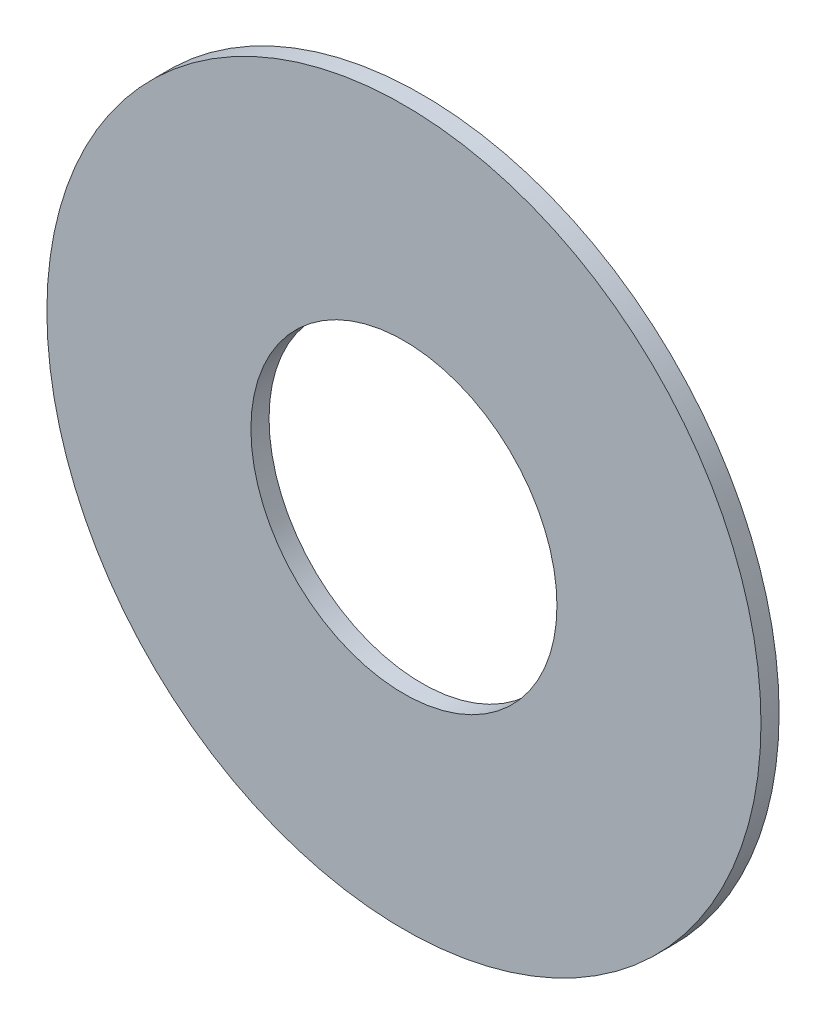
ISO-10303-21;
HEADER;
FILE_DESCRIPTION(('STEP AP214'),'2;1');
FILE_NAME('part.step','',(''),(''),'','','');
FILE_SCHEMA(('AUTOMOTIVE_DESIGN { 1 0 10303 214 1 1 1 1 }'));
ENDSEC;
DATA;
#1=APPLICATION_CONTEXT('core data for automotive mechanical design processes');
#2=APPLICATION_PROTOCOL_DEFINITION('international standard','automotive_design',2000,#1);
#3=PRODUCT_CONTEXT('',#1,'mechanical');
#4=PRODUCT('Part','Part','',(#3));
#5=PRODUCT_RELATED_PRODUCT_CATEGORY('part','',(#4));
#6=PRODUCT_DEFINITION_FORMATION('','',#4);
#7=PRODUCT_DEFINITION_CONTEXT('part definition',#1,'design');
#8=PRODUCT_DEFINITION('design','',#6,#7);
#9=PRODUCT_DEFINITION_SHAPE('','',#8);
#10=(LENGTH_UNIT() NAMED_UNIT(*) SI_UNIT(.MILLI.,.METRE.));
#11=(NAMED_UNIT(*) PLANE_ANGLE_UNIT() SI_UNIT($,.RADIAN.));
#12=(NAMED_UNIT(*) SI_UNIT($,.STERADIAN.) SOLID_ANGLE_UNIT());
#13=UNCERTAINTY_MEASURE_WITH_UNIT(LENGTH_MEASURE(1.E-05),#10,'distance_accuracy_value','');
#14=(GEOMETRIC_REPRESENTATION_CONTEXT(3) GLOBAL_UNCERTAINTY_ASSIGNED_CONTEXT((#13)) GLOBAL_UNIT_ASSIGNED_CONTEXT((#10,
#11,#12)) REPRESENTATION_CONTEXT('',''));
#15=CARTESIAN_POINT('',(0.,0.,0.));
#16=DIRECTION('',(0.,0.,1.));
#17=DIRECTION('',(1.,0.,0.));
#18=AXIS2_PLACEMENT_3D('',#15,#16,#17);
#19=CARTESIAN_POINT('',(0.,0.,0.));
#20=DIRECTION('',(0.,0.,-1.));
#21=DIRECTION('',(1.,0.,0.));
#22=AXIS2_PLACEMENT_3D('',#19,#20,#21);
#23=CYLINDRICAL_SURFACE('',#22,0.6999986);
#24=CARTESIAN_POINT('',(0.,0.,0.03556));
#25=DIRECTION('',(0.,0.,1.));
#26=DIRECTION('',(1.,0.,0.));
#27=AXIS2_PLACEMENT_3D('',#24,#25,#26);
#28=CIRCLE('',#27,0.6999986);
#29=CARTESIAN_POINT('',(0.6999986,0.,0.03556));
#30=VERTEX_POINT('',#29);
#31=EDGE_CURVE('E11',#30,#30,#28,.T.);
#32=ORIENTED_EDGE('',*,*,#31,.F.);
#33=DIRECTION('',(0.,0.,1.));
#34=VECTOR('',#33,1.);
#35=CARTESIAN_POINT('',(0.6999986,0.,0.));
#36=LINE('',#35,#34);
#37=CARTESIAN_POINT('',(0.6999986,0.,0.));
#38=VERTEX_POINT('',#37);
#39=EDGE_CURVE('E24',#38,#30,#36,.T.);
#40=ORIENTED_EDGE('',*,*,#39,.F.);
#41=CARTESIAN_POINT('',(0.,0.,0.));
#42=DIRECTION('',(0.,0.,1.));
#43=DIRECTION('',(1.,0.,0.));
#44=AXIS2_PLACEMENT_3D('',#41,#42,#43);
#45=CIRCLE('',#44,0.6999986);
#46=EDGE_CURVE('E46',#38,#38,#45,.T.);
#47=ORIENTED_EDGE('',*,*,#46,.T.);
#48=ORIENTED_EDGE('',*,*,#39,.T.);
#49=EDGE_LOOP('',(#32,#40,#47,#48));
#50=FACE_BOUND('',#49,.T.);
#51=ADVANCED_FACE('F17',(#50),#23,.T.);
#52=CARTESIAN_POINT('',(0.,0.,0.));
#53=DIRECTION('',(0.,0.,-1.));
#54=DIRECTION('',(1.,0.,0.));
#55=AXIS2_PLACEMENT_3D('',#52,#53,#54);
#56=CYLINDRICAL_SURFACE('',#55,0.2999994);
#57=DIRECTION('',(0.,0.,1.));
#58=VECTOR('',#57,1.);
#59=CARTESIAN_POINT('',(0.2999994,0.,0.));
#60=LINE('',#59,#58);
#61=CARTESIAN_POINT('',(0.2999994,0.,0.));
#62=VERTEX_POINT('',#61);
#63=CARTESIAN_POINT('',(0.2999994,0.,0.03556));
#64=VERTEX_POINT('',#63);
#65=EDGE_CURVE('E40',#62,#64,#60,.T.);
#66=ORIENTED_EDGE('',*,*,#65,.T.);
#67=CARTESIAN_POINT('',(0.,0.,0.03556));
#68=DIRECTION('',(0.,0.,1.));
#69=DIRECTION('',(1.,0.,0.));
#70=AXIS2_PLACEMENT_3D('',#67,#68,#69);
#71=CIRCLE('',#70,0.2999994);
#72=EDGE_CURVE('E45',#64,#64,#71,.T.);
#73=ORIENTED_EDGE('',*,*,#72,.T.);
#74=ORIENTED_EDGE('',*,*,#65,.F.);
#75=CARTESIAN_POINT('',(0.,0.,0.));
#76=DIRECTION('',(0.,0.,1.));
#77=DIRECTION('',(1.,0.,0.));
#78=AXIS2_PLACEMENT_3D('',#75,#76,#77);
#79=CIRCLE('',#78,0.2999994);
#80=EDGE_CURVE('E43',#62,#62,#79,.T.);
#81=ORIENTED_EDGE('',*,*,#80,.F.);
#82=EDGE_LOOP('',(#66,#73,#74,#81));
#83=FACE_BOUND('',#82,.T.);
#84=ADVANCED_FACE('F42',(#83),#56,.F.);
#85=CARTESIAN_POINT('',(0.6999986,0.,0.));
#86=DIRECTION('',(0.,0.,-1.));
#87=DIRECTION('',(-1.,0.,0.));
#88=AXIS2_PLACEMENT_3D('',#85,#86,#87);
#89=PLANE('',#88);
#90=ORIENTED_EDGE('',*,*,#46,.F.);
#91=EDGE_LOOP('',(#90));
#92=FACE_BOUND('',#91,.T.);
#93=ORIENTED_EDGE('',*,*,#80,.T.);
#94=EDGE_LOOP('',(#93));
#95=FACE_BOUND('',#94,.T.);
#96=ADVANCED_FACE('F49',(#92,#95),#89,.T.);
#97=CARTESIAN_POINT('',(0.6999986,0.,0.03556));
#98=DIRECTION('',(0.,0.,-1.));
#99=DIRECTION('',(-1.,0.,0.));
#100=AXIS2_PLACEMENT_3D('',#97,#98,#99);
#101=PLANE('',#100);
#102=ORIENTED_EDGE('',*,*,#31,.T.);
#103=EDGE_LOOP('',(#102));
#104=FACE_BOUND('',#103,.T.);
#105=ORIENTED_EDGE('',*,*,#72,.F.);
#106=EDGE_LOOP('',(#105));
#107=FACE_BOUND('',#106,.T.);
#108=ADVANCED_FACE('F56',(#104,#107),#101,.F.);
#109=CLOSED_SHELL('',(#51,#84,#96,#108));
#110=MANIFOLD_SOLID_BREP('B1',#109);
#111=ADVANCED_BREP_SHAPE_REPRESENTATION('',(#18,#110),#14);
#112=SHAPE_DEFINITION_REPRESENTATION(#9,#111);
ENDSEC;
END-ISO-10303-21;
